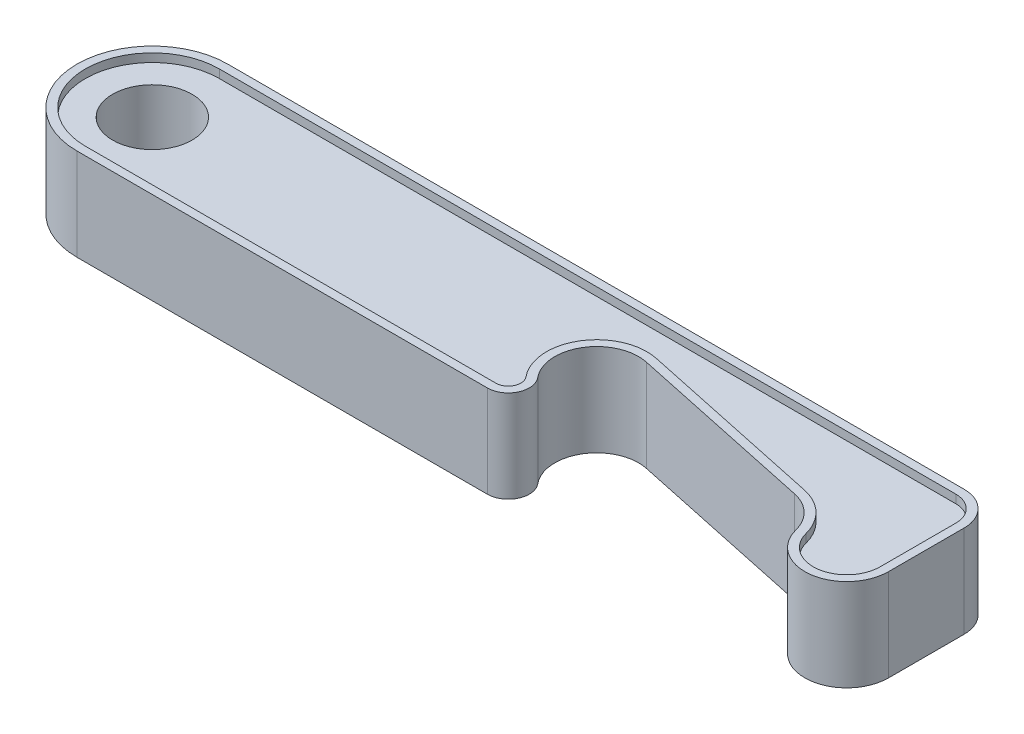
ISO-10303-21;
HEADER;
FILE_DESCRIPTION(('STEP AP214'),'2;1');
FILE_NAME('part.step','',(''),(''),'','','');
FILE_SCHEMA(('AUTOMOTIVE_DESIGN { 1 0 10303 214 1 1 1 1 }'));
ENDSEC;
DATA;
#1=APPLICATION_CONTEXT('core data for automotive mechanical design processes');
#2=APPLICATION_PROTOCOL_DEFINITION('international standard','automotive_design',2000,#1);
#3=PRODUCT_CONTEXT('',#1,'mechanical');
#4=PRODUCT('Part','Part','',(#3));
#5=PRODUCT_RELATED_PRODUCT_CATEGORY('part','',(#4));
#6=PRODUCT_DEFINITION_FORMATION('','',#4);
#7=PRODUCT_DEFINITION_CONTEXT('part definition',#1,'design');
#8=PRODUCT_DEFINITION('design','',#6,#7);
#9=PRODUCT_DEFINITION_SHAPE('','',#8);
#10=(LENGTH_UNIT() NAMED_UNIT(*) SI_UNIT(.MILLI.,.METRE.));
#11=(NAMED_UNIT(*) PLANE_ANGLE_UNIT() SI_UNIT($,.RADIAN.));
#12=(NAMED_UNIT(*) SI_UNIT($,.STERADIAN.) SOLID_ANGLE_UNIT());
#13=UNCERTAINTY_MEASURE_WITH_UNIT(LENGTH_MEASURE(1.E-05),#10,'distance_accuracy_value','');
#14=(GEOMETRIC_REPRESENTATION_CONTEXT(3) GLOBAL_UNCERTAINTY_ASSIGNED_CONTEXT((#13)) GLOBAL_UNIT_ASSIGNED_CONTEXT((#10,
#11,#12)) REPRESENTATION_CONTEXT('',''));
#15=CARTESIAN_POINT('',(0.,0.,0.));
#16=DIRECTION('',(0.,0.,1.));
#17=DIRECTION('',(1.,0.,0.));
#18=AXIS2_PLACEMENT_3D('',#15,#16,#17);
#19=CARTESIAN_POINT('',(0.,5.5,-8.));
#20=DIRECTION('',(0.,0.,-1.));
#21=DIRECTION('',(-1.,0.,0.));
#22=AXIS2_PLACEMENT_3D('',#19,#20,#21);
#23=PLANE('',#22);
#24=DIRECTION('',(1.,0.,0.));
#25=VECTOR('',#24,1.);
#26=CARTESIAN_POINT('',(0.,-4.5,-8.));
#27=LINE('',#26,#25);
#28=CARTESIAN_POINT('',(0.,-4.5,-8.));
#29=VERTEX_POINT('',#28);
#30=CARTESIAN_POINT('',(88.,-4.5,-8.));
#31=VERTEX_POINT('',#30);
#32=EDGE_CURVE('E120',#29,#31,#27,.T.);
#33=ORIENTED_EDGE('',*,*,#32,.F.);
#34=DIRECTION('',(0.,-1.,0.));
#35=VECTOR('',#34,1.);
#36=CARTESIAN_POINT('',(0.,5.5,-8.));
#37=LINE('',#36,#35);
#38=CARTESIAN_POINT('',(0.,-5.5,-8.));
#39=VERTEX_POINT('',#38);
#40=EDGE_CURVE('E327',#29,#39,#37,.T.);
#41=ORIENTED_EDGE('',*,*,#40,.T.);
#42=DIRECTION('',(1.,0.,0.));
#43=VECTOR('',#42,1.);
#44=CARTESIAN_POINT('',(0.,-5.5,-8.));
#45=LINE('',#44,#43);
#46=CARTESIAN_POINT('',(88.,-5.5,-8.));
#47=VERTEX_POINT('',#46);
#48=EDGE_CURVE('E575',#39,#47,#45,.T.);
#49=ORIENTED_EDGE('',*,*,#48,.T.);
#50=DIRECTION('',(0.,-1.,0.));
#51=VECTOR('',#50,1.);
#52=CARTESIAN_POINT('',(88.,5.5,-8.));
#53=LINE('',#52,#51);
#54=EDGE_CURVE('E368',#31,#47,#53,.T.);
#55=ORIENTED_EDGE('',*,*,#54,.F.);
#56=EDGE_LOOP('',(#33,#41,#49,#55));
#57=FACE_BOUND('',#56,.T.);
#58=ADVANCED_FACE('F103',(#57),#23,.F.);
#59=CARTESIAN_POINT('',(0.,5.5,0.));
#60=DIRECTION('',(0.,-1.,0.));
#61=DIRECTION('',(0.,0.,-1.));
#62=AXIS2_PLACEMENT_3D('',#59,#60,#61);
#63=CYLINDRICAL_SURFACE('',#62,8.);
#64=ORIENTED_EDGE('',*,*,#40,.F.);
#65=CARTESIAN_POINT('',(0.,-4.5,0.));
#66=DIRECTION('',(0.,1.,0.));
#67=DIRECTION('',(0.,0.,1.));
#68=AXIS2_PLACEMENT_3D('',#65,#66,#67);
#69=CIRCLE('',#68,8.);
#70=CARTESIAN_POINT('',(0.,-4.5,8.));
#71=VERTEX_POINT('',#70);
#72=EDGE_CURVE('E127',#29,#71,#69,.T.);
#73=ORIENTED_EDGE('',*,*,#72,.T.);
#74=DIRECTION('',(0.,-1.,0.));
#75=VECTOR('',#74,1.);
#76=CARTESIAN_POINT('',(0.,5.5,8.));
#77=LINE('',#76,#75);
#78=CARTESIAN_POINT('',(0.,-5.5,8.));
#79=VERTEX_POINT('',#78);
#80=EDGE_CURVE('E337',#71,#79,#77,.T.);
#81=ORIENTED_EDGE('',*,*,#80,.T.);
#82=CARTESIAN_POINT('',(0.,-5.5,0.));
#83=DIRECTION('',(0.,1.,0.));
#84=DIRECTION('',(0.,0.,1.));
#85=AXIS2_PLACEMENT_3D('',#82,#83,#84);
#86=CIRCLE('',#85,8.);
#87=EDGE_CURVE('E334',#39,#79,#86,.T.);
#88=ORIENTED_EDGE('',*,*,#87,.F.);
#89=EDGE_LOOP('',(#64,#73,#81,#88));
#90=FACE_BOUND('',#89,.T.);
#91=ADVANCED_FACE('F490',(#90),#63,.F.);
#92=CARTESIAN_POINT('',(0.,5.5,8.));
#93=DIRECTION('',(0.,0.,-1.));
#94=DIRECTION('',(-1.,0.,0.));
#95=AXIS2_PLACEMENT_3D('',#92,#93,#94);
#96=PLANE('',#95);
#97=ORIENTED_EDGE('',*,*,#80,.F.);
#98=DIRECTION('',(1.,0.,0.));
#99=VECTOR('',#98,1.);
#100=CARTESIAN_POINT('',(0.,-4.5,8.));
#101=LINE('',#100,#99);
#102=CARTESIAN_POINT('',(49.0303312216233,-4.5,8.));
#103=VERTEX_POINT('',#102);
#104=EDGE_CURVE('E606',#71,#103,#101,.T.);
#105=ORIENTED_EDGE('',*,*,#104,.T.);
#106=DIRECTION('',(0.,-1.,0.));
#107=VECTOR('',#106,1.);
#108=CARTESIAN_POINT('',(49.0303312216233,5.5,8.));
#109=LINE('',#108,#107);
#110=CARTESIAN_POINT('',(49.0303312216233,-5.5,8.));
#111=VERTEX_POINT('',#110);
#112=EDGE_CURVE('E341',#103,#111,#109,.T.);
#113=ORIENTED_EDGE('',*,*,#112,.T.);
#114=DIRECTION('',(1.,0.,0.));
#115=VECTOR('',#114,1.);
#116=CARTESIAN_POINT('',(0.,-5.5,8.));
#117=LINE('',#116,#115);
#118=EDGE_CURVE('E553',#79,#111,#117,.T.);
#119=ORIENTED_EDGE('',*,*,#118,.F.);
#120=EDGE_LOOP('',(#97,#105,#113,#119));
#121=FACE_BOUND('',#120,.T.);
#122=ADVANCED_FACE('F496',(#121),#96,.T.);
#123=CARTESIAN_POINT('',(49.0303312216233,5.5,6.5));
#124=DIRECTION('',(0.,-1.,0.));
#125=DIRECTION('',(0.,0.,-1.));
#126=AXIS2_PLACEMENT_3D('',#123,#124,#125);
#127=CYLINDRICAL_SURFACE('',#126,1.5);
#128=ORIENTED_EDGE('',*,*,#112,.F.);
#129=CARTESIAN_POINT('',(49.0303312216233,-4.5,6.5));
#130=DIRECTION('',(0.,1.,0.));
#131=DIRECTION('',(0.,0.,1.));
#132=AXIS2_PLACEMENT_3D('',#129,#130,#131);
#133=CIRCLE('',#132,1.5);
#134=CARTESIAN_POINT('',(50.1857961015929,-4.5,5.54349547248493));
#135=VERTEX_POINT('',#134);
#136=EDGE_CURVE('E611',#103,#135,#133,.T.);
#137=ORIENTED_EDGE('',*,*,#136,.T.);
#138=DIRECTION('',(0.,-1.,0.));
#139=VECTOR('',#138,1.);
#140=CARTESIAN_POINT('',(50.1857961015929,5.5,5.54349547248493));
#141=LINE('',#140,#139);
#142=CARTESIAN_POINT('',(50.1857961015929,-5.5,5.54349547248493));
#143=VERTEX_POINT('',#142);
#144=EDGE_CURVE('E345',#135,#143,#141,.T.);
#145=ORIENTED_EDGE('',*,*,#144,.T.);
#146=CARTESIAN_POINT('',(49.0303312216233,-5.5,6.5));
#147=DIRECTION('',(0.,1.,0.));
#148=DIRECTION('',(0.,0.,1.));
#149=AXIS2_PLACEMENT_3D('',#146,#147,#148);
#150=CIRCLE('',#149,1.5);
#151=EDGE_CURVE('E596',#111,#143,#150,.T.);
#152=ORIENTED_EDGE('',*,*,#151,.F.);
#153=EDGE_LOOP('',(#128,#137,#145,#152));
#154=FACE_BOUND('',#153,.T.);
#155=ADVANCED_FACE('F609',(#154),#127,.F.);
#156=CARTESIAN_POINT('',(54.8076556214714,5.5,1.71747736242466));
#157=DIRECTION('',(0.,-1.,0.));
#158=DIRECTION('',(0.,0.,-1.));
#159=AXIS2_PLACEMENT_3D('',#156,#157,#158);
#160=CYLINDRICAL_SURFACE('',#159,6.);
#161=CARTESIAN_POINT('',(54.8076556214714,-4.5,1.71747736242466));
#162=DIRECTION('',(0.,1.,0.));
#163=DIRECTION('',(0.,0.,1.));
#164=AXIS2_PLACEMENT_3D('',#161,#162,#163);
#165=CIRCLE('',#164,6.);
#166=CARTESIAN_POINT('',(56.0551257663779,-4.5,-4.15140824197818));
#167=VERTEX_POINT('',#166);
#168=EDGE_CURVE('E647',#167,#135,#165,.T.);
#169=ORIENTED_EDGE('',*,*,#168,.F.);
#170=DIRECTION('',(0.,-1.,0.));
#171=VECTOR('',#170,1.);
#172=CARTESIAN_POINT('',(56.0551257663779,5.5,-4.15140824197818));
#173=LINE('',#172,#171);
#174=CARTESIAN_POINT('',(56.0551257663779,-5.5,-4.15140824197818));
#175=VERTEX_POINT('',#174);
#176=EDGE_CURVE('E349',#167,#175,#173,.T.);
#177=ORIENTED_EDGE('',*,*,#176,.T.);
#178=CARTESIAN_POINT('',(54.8076556214714,-5.5,1.71747736242466));
#179=DIRECTION('',(0.,1.,0.));
#180=DIRECTION('',(0.,0.,1.));
#181=AXIS2_PLACEMENT_3D('',#178,#179,#180);
#182=CIRCLE('',#181,6.);
#183=EDGE_CURVE('E593',#175,#143,#182,.T.);
#184=ORIENTED_EDGE('',*,*,#183,.T.);
#185=ORIENTED_EDGE('',*,*,#144,.F.);
#186=EDGE_LOOP('',(#169,#177,#184,#185));
#187=FACE_BOUND('',#186,.T.);
#188=ADVANCED_FACE('F614',(#187),#160,.T.);
#189=CARTESIAN_POINT('',(78.5551257663779,5.5,0.631114395597155));
#190=DIRECTION('',(-0.207911690817753,0.,0.978147600733807));
#191=DIRECTION('',(0.978147600733807,0.,0.207911690817753));
#192=AXIS2_PLACEMENT_3D('',#189,#190,#191);
#193=PLANE('',#192);
#194=DIRECTION('',(-0.978147600733807,0.,-0.207911690817753));
#195=VECTOR('',#194,1.);
#196=CARTESIAN_POINT('',(3.26737504864885,-4.5,-15.3717910328325));
#197=LINE('',#196,#195);
#198=CARTESIAN_POINT('',(78.5551257663779,-4.5,0.631114395597155));
#199=VERTEX_POINT('',#198);
#200=EDGE_CURVE('E623',#199,#167,#197,.T.);
#201=ORIENTED_EDGE('',*,*,#200,.F.);
#202=DIRECTION('',(0.,-1.,0.));
#203=VECTOR('',#202,1.);
#204=CARTESIAN_POINT('',(78.5551257663779,5.5,0.631114395597155));
#205=LINE('',#204,#203);
#206=CARTESIAN_POINT('',(78.5551257663779,-5.5,0.631114395597155));
#207=VERTEX_POINT('',#206);
#208=EDGE_CURVE('E353',#199,#207,#205,.T.);
#209=ORIENTED_EDGE('',*,*,#208,.T.);
#210=DIRECTION('',(-0.978147600733807,0.,-0.207911690817753));
#211=VECTOR('',#210,1.);
#212=CARTESIAN_POINT('',(78.5551257663779,-5.5,0.631114395597155));
#213=LINE('',#212,#211);
#214=EDGE_CURVE('E590',#207,#175,#213,.T.);
#215=ORIENTED_EDGE('',*,*,#214,.T.);
#216=ORIENTED_EDGE('',*,*,#176,.F.);
#217=EDGE_LOOP('',(#201,#209,#215,#216));
#218=FACE_BOUND('',#217,.T.);
#219=ADVANCED_FACE('F620',(#218),#193,.F.);
#220=CARTESIAN_POINT('',(77.3076556214714,5.5,6.5));
#221=DIRECTION('',(0.,-1.,0.));
#222=DIRECTION('',(0.,0.,-1.));
#223=AXIS2_PLACEMENT_3D('',#220,#221,#222);
#224=CYLINDRICAL_SURFACE('',#223,5.99999999999999);
#225=ORIENTED_EDGE('',*,*,#208,.F.);
#226=CARTESIAN_POINT('',(77.3076556214714,-4.5,6.5));
#227=DIRECTION('',(0.,1.,0.));
#228=DIRECTION('',(0.,0.,1.));
#229=AXIS2_PLACEMENT_3D('',#226,#227,#228);
#230=CIRCLE('',#229,5.99999999999999);
#231=CARTESIAN_POINT('',(83.1230622485886,-4.5,5.0231635969812));
#232=VERTEX_POINT('',#231);
#233=EDGE_CURVE('E628',#199,#232,#230,.F.);
#234=ORIENTED_EDGE('',*,*,#233,.T.);
#235=DIRECTION('',(0.,-1.,0.));
#236=VECTOR('',#235,1.);
#237=CARTESIAN_POINT('',(83.1230622485886,5.5,5.0231635969812));
#238=LINE('',#237,#236);
#239=CARTESIAN_POINT('',(83.1230622485886,-5.5,5.0231635969812));
#240=VERTEX_POINT('',#239);
#241=EDGE_CURVE('E357',#232,#240,#238,.T.);
#242=ORIENTED_EDGE('',*,*,#241,.T.);
#243=CARTESIAN_POINT('',(77.3076556214714,-5.5,6.5));
#244=DIRECTION('',(0.,-1.,0.));
#245=DIRECTION('',(0.,0.,-1.));
#246=AXIS2_PLACEMENT_3D('',#243,#244,#245);
#247=CIRCLE('',#246,5.99999999999999);
#248=EDGE_CURVE('E587',#207,#240,#247,.T.);
#249=ORIENTED_EDGE('',*,*,#248,.F.);
#250=EDGE_LOOP('',(#225,#234,#242,#249));
#251=FACE_BOUND('',#250,.T.);
#252=ADVANCED_FACE('F626',(#251),#224,.T.);
#253=CARTESIAN_POINT('',(87.,5.5,4.03860599496867));
#254=DIRECTION('',(0.,-1.,0.));
#255=DIRECTION('',(0.,0.,-1.));
#256=AXIS2_PLACEMENT_3D('',#253,#254,#255);
#257=CYLINDRICAL_SURFACE('',#256,4.00000000000001);
#258=CARTESIAN_POINT('',(87.,-4.5,4.03860599496867));
#259=DIRECTION('',(0.,1.,0.));
#260=DIRECTION('',(0.,0.,1.));
#261=AXIS2_PLACEMENT_3D('',#258,#259,#260);
#262=CIRCLE('',#261,4.00000000000001);
#263=CARTESIAN_POINT('',(91.,-4.5,4.03860599496867));
#264=VERTEX_POINT('',#263);
#265=EDGE_CURVE('E651',#264,#232,#262,.F.);
#266=ORIENTED_EDGE('',*,*,#265,.F.);
#267=DIRECTION('',(0.,-1.,0.));
#268=VECTOR('',#267,1.);
#269=CARTESIAN_POINT('',(91.,5.5,4.03860599496867));
#270=LINE('',#269,#268);
#271=CARTESIAN_POINT('',(91.,-5.5,4.03860599496867));
#272=VERTEX_POINT('',#271);
#273=EDGE_CURVE('E361',#264,#272,#270,.T.);
#274=ORIENTED_EDGE('',*,*,#273,.T.);
#275=CARTESIAN_POINT('',(87.,-5.5,4.03860599496867));
#276=DIRECTION('',(0.,-1.,0.));
#277=DIRECTION('',(0.,0.,-1.));
#278=AXIS2_PLACEMENT_3D('',#275,#276,#277);
#279=CIRCLE('',#278,4.00000000000001);
#280=EDGE_CURVE('E584',#272,#240,#279,.T.);
#281=ORIENTED_EDGE('',*,*,#280,.T.);
#282=ORIENTED_EDGE('',*,*,#241,.F.);
#283=EDGE_LOOP('',(#266,#274,#281,#282));
#284=FACE_BOUND('',#283,.T.);
#285=ADVANCED_FACE('F527',(#284),#257,.F.);
#286=CARTESIAN_POINT('',(91.,5.5,-5.));
#287=DIRECTION('',(1.,0.,0.));
#288=DIRECTION('',(0.,0.,-1.));
#289=AXIS2_PLACEMENT_3D('',#286,#287,#288);
#290=PLANE('',#289);
#291=DIRECTION('',(0.,0.,1.));
#292=VECTOR('',#291,1.);
#293=CARTESIAN_POINT('',(91.,-4.5,0.));
#294=LINE('',#293,#292);
#295=CARTESIAN_POINT('',(91.,-4.5,-5.));
#296=VERTEX_POINT('',#295);
#297=EDGE_CURVE('E636',#296,#264,#294,.T.);
#298=ORIENTED_EDGE('',*,*,#297,.F.);
#299=DIRECTION('',(0.,-1.,0.));
#300=VECTOR('',#299,1.);
#301=CARTESIAN_POINT('',(91.,5.5,-5.));
#302=LINE('',#301,#300);
#303=CARTESIAN_POINT('',(91.,-5.5,-5.));
#304=VERTEX_POINT('',#303);
#305=EDGE_CURVE('E365',#296,#304,#302,.T.);
#306=ORIENTED_EDGE('',*,*,#305,.T.);
#307=DIRECTION('',(0.,0.,1.));
#308=VECTOR('',#307,1.);
#309=CARTESIAN_POINT('',(91.,-5.5,-5.));
#310=LINE('',#309,#308);
#311=EDGE_CURVE('E581',#304,#272,#310,.T.);
#312=ORIENTED_EDGE('',*,*,#311,.T.);
#313=ORIENTED_EDGE('',*,*,#273,.F.);
#314=EDGE_LOOP('',(#298,#306,#312,#313));
#315=FACE_BOUND('',#314,.T.);
#316=ADVANCED_FACE('F521',(#315),#290,.F.);
#317=CARTESIAN_POINT('',(88.,5.5,-5.));
#318=DIRECTION('',(0.,-1.,0.));
#319=DIRECTION('',(0.,0.,-1.));
#320=AXIS2_PLACEMENT_3D('',#317,#318,#319);
#321=CYLINDRICAL_SURFACE('',#320,3.);
#322=CARTESIAN_POINT('',(88.,-4.5,-5.));
#323=DIRECTION('',(0.,1.,0.));
#324=DIRECTION('',(0.,0.,1.));
#325=AXIS2_PLACEMENT_3D('',#322,#323,#324);
#326=CIRCLE('',#325,3.);
#327=EDGE_CURVE('E555',#31,#296,#326,.F.);
#328=ORIENTED_EDGE('',*,*,#327,.F.);
#329=ORIENTED_EDGE('',*,*,#54,.T.);
#330=CARTESIAN_POINT('',(88.,-5.5,-5.));
#331=DIRECTION('',(0.,-1.,0.));
#332=DIRECTION('',(0.,0.,-1.));
#333=AXIS2_PLACEMENT_3D('',#330,#331,#332);
#334=CIRCLE('',#333,3.);
#335=EDGE_CURVE('E578',#47,#304,#334,.T.);
#336=ORIENTED_EDGE('',*,*,#335,.T.);
#337=ORIENTED_EDGE('',*,*,#305,.F.);
#338=EDGE_LOOP('',(#328,#329,#336,#337));
#339=FACE_BOUND('',#338,.T.);
#340=ADVANCED_FACE('F518',(#339),#321,.F.);
#341=CARTESIAN_POINT('',(0.,5.5,-9.));
#342=DIRECTION('',(0.,0.,-1.));
#343=DIRECTION('',(-1.,0.,0.));
#344=AXIS2_PLACEMENT_3D('',#341,#342,#343);
#345=PLANE('',#344);
#346=DIRECTION('',(1.,0.,0.));
#347=VECTOR('',#346,1.);
#348=CARTESIAN_POINT('',(0.,-5.5,-9.));
#349=LINE('',#348,#347);
#350=CARTESIAN_POINT('',(0.,-5.5,-9.));
#351=VERTEX_POINT('',#350);
#352=CARTESIAN_POINT('',(88.,-5.5,-9.));
#353=VERTEX_POINT('',#352);
#354=EDGE_CURVE('E326',#351,#353,#349,.T.);
#355=ORIENTED_EDGE('',*,*,#354,.F.);
#356=DIRECTION('',(0.,-1.,0.));
#357=VECTOR('',#356,1.);
#358=CARTESIAN_POINT('',(0.,5.5,-9.));
#359=LINE('',#358,#357);
#360=CARTESIAN_POINT('',(0.,5.5,-9.));
#361=VERTEX_POINT('',#360);
#362=EDGE_CURVE('E12',#361,#351,#359,.T.);
#363=ORIENTED_EDGE('',*,*,#362,.F.);
#364=DIRECTION('',(1.,0.,0.));
#365=VECTOR('',#364,1.);
#366=CARTESIAN_POINT('',(0.,5.5,-9.));
#367=LINE('',#366,#365);
#368=CARTESIAN_POINT('',(88.,5.5,-9.));
#369=VERTEX_POINT('',#368);
#370=EDGE_CURVE('E369',#361,#369,#367,.T.);
#371=ORIENTED_EDGE('',*,*,#370,.T.);
#372=DIRECTION('',(0.,-1.,0.));
#373=VECTOR('',#372,1.);
#374=CARTESIAN_POINT('',(88.,5.5,-9.));
#375=LINE('',#374,#373);
#376=EDGE_CURVE('E107',#369,#353,#375,.T.);
#377=ORIENTED_EDGE('',*,*,#376,.T.);
#378=EDGE_LOOP('',(#355,#363,#371,#377));
#379=FACE_BOUND('',#378,.T.);
#380=ADVANCED_FACE('F105',(#379),#345,.T.);
#381=CARTESIAN_POINT('',(0.,5.5,0.));
#382=DIRECTION('',(0.,-1.,0.));
#383=DIRECTION('',(0.,0.,-1.));
#384=AXIS2_PLACEMENT_3D('',#381,#382,#383);
#385=CYLINDRICAL_SURFACE('',#384,9.);
#386=CARTESIAN_POINT('',(0.,-5.5,0.));
#387=DIRECTION('',(0.,1.,0.));
#388=DIRECTION('',(0.,0.,1.));
#389=AXIS2_PLACEMENT_3D('',#386,#387,#388);
#390=CIRCLE('',#389,9.);
#391=CARTESIAN_POINT('',(0.,-5.5,9.));
#392=VERTEX_POINT('',#391);
#393=EDGE_CURVE('E373',#351,#392,#390,.T.);
#394=ORIENTED_EDGE('',*,*,#393,.T.);
#395=DIRECTION('',(0.,-1.,0.));
#396=VECTOR('',#395,1.);
#397=CARTESIAN_POINT('',(0.,5.5,9.));
#398=LINE('',#397,#396);
#399=CARTESIAN_POINT('',(0.,5.5,9.));
#400=VERTEX_POINT('',#399);
#401=EDGE_CURVE('E112',#400,#392,#398,.T.);
#402=ORIENTED_EDGE('',*,*,#401,.F.);
#403=CARTESIAN_POINT('',(0.,5.5,0.));
#404=DIRECTION('',(0.,1.,0.));
#405=DIRECTION('',(0.,0.,1.));
#406=AXIS2_PLACEMENT_3D('',#403,#404,#405);
#407=CIRCLE('',#406,9.);
#408=EDGE_CURVE('E394',#361,#400,#407,.T.);
#409=ORIENTED_EDGE('',*,*,#408,.F.);
#410=ORIENTED_EDGE('',*,*,#362,.T.);
#411=EDGE_LOOP('',(#394,#402,#409,#410));
#412=FACE_BOUND('',#411,.T.);
#413=ADVANCED_FACE('F449',(#412),#385,.T.);
#414=CARTESIAN_POINT('',(0.,5.5,9.));
#415=DIRECTION('',(0.,0.,-1.));
#416=DIRECTION('',(-1.,0.,0.));
#417=AXIS2_PLACEMENT_3D('',#414,#415,#416);
#418=PLANE('',#417);
#419=DIRECTION('',(1.,0.,0.));
#420=VECTOR('',#419,1.);
#421=CARTESIAN_POINT('',(0.,-5.5,9.));
#422=LINE('',#421,#420);
#423=CARTESIAN_POINT('',(49.0303312216233,-5.5,9.));
#424=VERTEX_POINT('',#423);
#425=EDGE_CURVE('E416',#392,#424,#422,.T.);
#426=ORIENTED_EDGE('',*,*,#425,.T.);
#427=DIRECTION('',(0.,-1.,0.));
#428=VECTOR('',#427,1.);
#429=CARTESIAN_POINT('',(49.0303312216233,5.5,9.));
#430=LINE('',#429,#428);
#431=CARTESIAN_POINT('',(49.0303312216233,5.5,9.));
#432=VERTEX_POINT('',#431);
#433=EDGE_CURVE('E421',#432,#424,#430,.T.);
#434=ORIENTED_EDGE('',*,*,#433,.F.);
#435=DIRECTION('',(1.,0.,0.));
#436=VECTOR('',#435,1.);
#437=CARTESIAN_POINT('',(0.,5.5,9.));
#438=LINE('',#437,#436);
#439=EDGE_CURVE('E392',#400,#432,#438,.T.);
#440=ORIENTED_EDGE('',*,*,#439,.F.);
#441=ORIENTED_EDGE('',*,*,#401,.T.);
#442=EDGE_LOOP('',(#426,#434,#440,#441));
#443=FACE_BOUND('',#442,.T.);
#444=ADVANCED_FACE('F453',(#443),#418,.F.);
#445=CARTESIAN_POINT('',(49.0303312216233,5.5,6.5));
#446=DIRECTION('',(0.,-1.,0.));
#447=DIRECTION('',(0.,0.,-1.));
#448=AXIS2_PLACEMENT_3D('',#445,#446,#447);
#449=CYLINDRICAL_SURFACE('',#448,2.5);
#450=CARTESIAN_POINT('',(49.0303312216233,-5.5,6.5));
#451=DIRECTION('',(0.,1.,0.));
#452=DIRECTION('',(0.,0.,1.));
#453=AXIS2_PLACEMENT_3D('',#450,#451,#452);
#454=CIRCLE('',#453,2.5);
#455=CARTESIAN_POINT('',(50.9561060215727,-5.5,4.90582578747489));
#456=VERTEX_POINT('',#455);
#457=EDGE_CURVE('E413',#424,#456,#454,.T.);
#458=ORIENTED_EDGE('',*,*,#457,.T.);
#459=DIRECTION('',(0.,-1.,0.));
#460=VECTOR('',#459,1.);
#461=CARTESIAN_POINT('',(50.9561060215727,5.5,4.90582578747489));
#462=LINE('',#461,#460);
#463=CARTESIAN_POINT('',(50.9561060215727,5.5,4.90582578747489));
#464=VERTEX_POINT('',#463);
#465=EDGE_CURVE('E424',#464,#456,#462,.T.);
#466=ORIENTED_EDGE('',*,*,#465,.F.);
#467=CARTESIAN_POINT('',(49.0303312216233,5.5,6.5));
#468=DIRECTION('',(0.,1.,0.));
#469=DIRECTION('',(0.,0.,1.));
#470=AXIS2_PLACEMENT_3D('',#467,#468,#469);
#471=CIRCLE('',#470,2.5);
#472=EDGE_CURVE('E390',#432,#464,#471,.T.);
#473=ORIENTED_EDGE('',*,*,#472,.F.);
#474=ORIENTED_EDGE('',*,*,#433,.T.);
#475=EDGE_LOOP('',(#458,#466,#473,#474));
#476=FACE_BOUND('',#475,.T.);
#477=ADVANCED_FACE('F480',(#476),#449,.T.);
#478=CARTESIAN_POINT('',(54.8076556214714,5.5,1.71747736242466));
#479=DIRECTION('',(0.,-1.,0.));
#480=DIRECTION('',(0.,0.,-1.));
#481=AXIS2_PLACEMENT_3D('',#478,#479,#480);
#482=CYLINDRICAL_SURFACE('',#481,5.);
#483=CARTESIAN_POINT('',(54.8076556214714,-5.5,1.71747736242466));
#484=DIRECTION('',(0.,1.,0.));
#485=DIRECTION('',(0.,0.,1.));
#486=AXIS2_PLACEMENT_3D('',#483,#484,#485);
#487=CIRCLE('',#486,5.);
#488=CARTESIAN_POINT('',(55.8472140755601,-5.5,-3.17326064124437));
#489=VERTEX_POINT('',#488);
#490=EDGE_CURVE('E410',#489,#456,#487,.T.);
#491=ORIENTED_EDGE('',*,*,#490,.F.);
#492=DIRECTION('',(0.,-1.,0.));
#493=VECTOR('',#492,1.);
#494=CARTESIAN_POINT('',(55.8472140755601,5.5,-3.17326064124437));
#495=LINE('',#494,#493);
#496=CARTESIAN_POINT('',(55.8472140755601,5.5,-3.17326064124437));
#497=VERTEX_POINT('',#496);
#498=EDGE_CURVE('E426',#497,#489,#495,.T.);
#499=ORIENTED_EDGE('',*,*,#498,.F.);
#500=CARTESIAN_POINT('',(54.8076556214714,5.5,1.71747736242466));
#501=DIRECTION('',(0.,1.,0.));
#502=DIRECTION('',(0.,0.,1.));
#503=AXIS2_PLACEMENT_3D('',#500,#501,#502);
#504=CIRCLE('',#503,5.);
#505=EDGE_CURVE('E387',#497,#464,#504,.T.);
#506=ORIENTED_EDGE('',*,*,#505,.T.);
#507=ORIENTED_EDGE('',*,*,#465,.T.);
#508=EDGE_LOOP('',(#491,#499,#506,#507));
#509=FACE_BOUND('',#508,.T.);
#510=ADVANCED_FACE('F478',(#509),#482,.F.);
#511=CARTESIAN_POINT('',(78.3472140755601,5.5,1.60926199633096));
#512=DIRECTION('',(-0.207911690817753,0.,0.978147600733807));
#513=DIRECTION('',(0.978147600733807,0.,0.207911690817753));
#514=AXIS2_PLACEMENT_3D('',#511,#512,#513);
#515=PLANE('',#514);
#516=DIRECTION('',(-0.978147600733807,0.,-0.207911690817753));
#517=VECTOR('',#516,1.);
#518=CARTESIAN_POINT('',(78.3472140755601,-5.5,1.60926199633096));
#519=LINE('',#518,#517);
#520=CARTESIAN_POINT('',(78.3472140755601,-5.5,1.60926199633096));
#521=VERTEX_POINT('',#520);
#522=EDGE_CURVE('E407',#521,#489,#519,.T.);
#523=ORIENTED_EDGE('',*,*,#522,.F.);
#524=DIRECTION('',(0.,-1.,0.));
#525=VECTOR('',#524,1.);
#526=CARTESIAN_POINT('',(78.3472140755601,5.5,1.60926199633096));
#527=LINE('',#526,#525);
#528=CARTESIAN_POINT('',(78.3472140755601,5.5,1.60926199633096));
#529=VERTEX_POINT('',#528);
#530=EDGE_CURVE('E428',#529,#521,#527,.T.);
#531=ORIENTED_EDGE('',*,*,#530,.F.);
#532=DIRECTION('',(-0.978147600733807,0.,-0.207911690817753));
#533=VECTOR('',#532,1.);
#534=CARTESIAN_POINT('',(78.3472140755601,5.5,1.60926199633096));
#535=LINE('',#534,#533);
#536=EDGE_CURVE('E384',#529,#497,#535,.T.);
#537=ORIENTED_EDGE('',*,*,#536,.T.);
#538=ORIENTED_EDGE('',*,*,#498,.T.);
#539=EDGE_LOOP('',(#523,#531,#537,#538));
#540=FACE_BOUND('',#539,.T.);
#541=ADVANCED_FACE('F475',(#540),#515,.T.);
#542=CARTESIAN_POINT('',(77.3076556214714,5.5,6.5));
#543=DIRECTION('',(0.,-1.,0.));
#544=DIRECTION('',(0.,0.,-1.));
#545=AXIS2_PLACEMENT_3D('',#542,#543,#544);
#546=CYLINDRICAL_SURFACE('',#545,5.);
#547=CARTESIAN_POINT('',(77.3076556214714,-5.5,6.5));
#548=DIRECTION('',(0.,-1.,0.));
#549=DIRECTION('',(0.,0.,-1.));
#550=AXIS2_PLACEMENT_3D('',#547,#548,#549);
#551=CIRCLE('',#550,5.);
#552=CARTESIAN_POINT('',(82.1538278107357,-5.5,5.26930299748433));
#553=VERTEX_POINT('',#552);
#554=EDGE_CURVE('E404',#521,#553,#551,.T.);
#555=ORIENTED_EDGE('',*,*,#554,.T.);
#556=DIRECTION('',(0.,-1.,0.));
#557=VECTOR('',#556,1.);
#558=CARTESIAN_POINT('',(82.1538278107357,5.5,5.26930299748433));
#559=LINE('',#558,#557);
#560=CARTESIAN_POINT('',(82.1538278107357,5.5,5.26930299748433));
#561=VERTEX_POINT('',#560);
#562=EDGE_CURVE('E430',#561,#553,#559,.T.);
#563=ORIENTED_EDGE('',*,*,#562,.F.);
#564=CARTESIAN_POINT('',(77.3076556214714,5.5,6.5));
#565=DIRECTION('',(0.,-1.,0.));
#566=DIRECTION('',(0.,0.,-1.));
#567=AXIS2_PLACEMENT_3D('',#564,#565,#566);
#568=CIRCLE('',#567,5.);
#569=EDGE_CURVE('E382',#529,#561,#568,.T.);
#570=ORIENTED_EDGE('',*,*,#569,.F.);
#571=ORIENTED_EDGE('',*,*,#530,.T.);
#572=EDGE_LOOP('',(#555,#563,#570,#571));
#573=FACE_BOUND('',#572,.T.);
#574=ADVANCED_FACE('F472',(#573),#546,.F.);
#575=CARTESIAN_POINT('',(87.,5.5,4.03860599496867));
#576=DIRECTION('',(0.,-1.,0.));
#577=DIRECTION('',(0.,0.,-1.));
#578=AXIS2_PLACEMENT_3D('',#575,#576,#577);
#579=CYLINDRICAL_SURFACE('',#578,5.00000000000002);
#580=CARTESIAN_POINT('',(87.,-5.5,4.03860599496867));
#581=DIRECTION('',(0.,-1.,0.));
#582=DIRECTION('',(0.,0.,-1.));
#583=AXIS2_PLACEMENT_3D('',#580,#581,#582);
#584=CIRCLE('',#583,5.00000000000002);
#585=CARTESIAN_POINT('',(92.,-5.5,4.03860599496867));
#586=VERTEX_POINT('',#585);
#587=EDGE_CURVE('E401',#586,#553,#584,.T.);
#588=ORIENTED_EDGE('',*,*,#587,.F.);
#589=DIRECTION('',(0.,-1.,0.));
#590=VECTOR('',#589,1.);
#591=CARTESIAN_POINT('',(92.,5.5,4.03860599496867));
#592=LINE('',#591,#590);
#593=CARTESIAN_POINT('',(92.,5.5,4.03860599496867));
#594=VERTEX_POINT('',#593);
#595=EDGE_CURVE('E432',#594,#586,#592,.T.);
#596=ORIENTED_EDGE('',*,*,#595,.F.);
#597=CARTESIAN_POINT('',(87.,5.5,4.03860599496867));
#598=DIRECTION('',(0.,-1.,0.));
#599=DIRECTION('',(0.,0.,-1.));
#600=AXIS2_PLACEMENT_3D('',#597,#598,#599);
#601=CIRCLE('',#600,5.00000000000002);
#602=EDGE_CURVE('E379',#594,#561,#601,.T.);
#603=ORIENTED_EDGE('',*,*,#602,.T.);
#604=ORIENTED_EDGE('',*,*,#562,.T.);
#605=EDGE_LOOP('',(#588,#596,#603,#604));
#606=FACE_BOUND('',#605,.T.);
#607=ADVANCED_FACE('F468',(#606),#579,.T.);
#608=CARTESIAN_POINT('',(92.,5.5,-5.));
#609=DIRECTION('',(1.,0.,0.));
#610=DIRECTION('',(0.,0.,-1.));
#611=AXIS2_PLACEMENT_3D('',#608,#609,#610);
#612=PLANE('',#611);
#613=DIRECTION('',(0.,0.,1.));
#614=VECTOR('',#613,1.);
#615=CARTESIAN_POINT('',(92.,-5.5,-5.));
#616=LINE('',#615,#614);
#617=CARTESIAN_POINT('',(92.,-5.5,-5.));
#618=VERTEX_POINT('',#617);
#619=EDGE_CURVE('E398',#618,#586,#616,.T.);
#620=ORIENTED_EDGE('',*,*,#619,.F.);
#621=DIRECTION('',(0.,-1.,0.));
#622=VECTOR('',#621,1.);
#623=CARTESIAN_POINT('',(92.,5.5,-5.));
#624=LINE('',#623,#622);
#625=CARTESIAN_POINT('',(92.,5.5,-5.));
#626=VERTEX_POINT('',#625);
#627=EDGE_CURVE('E433',#626,#618,#624,.T.);
#628=ORIENTED_EDGE('',*,*,#627,.F.);
#629=DIRECTION('',(0.,0.,1.));
#630=VECTOR('',#629,1.);
#631=CARTESIAN_POINT('',(92.,5.5,-5.));
#632=LINE('',#631,#630);
#633=EDGE_CURVE('E376',#626,#594,#632,.T.);
#634=ORIENTED_EDGE('',*,*,#633,.T.);
#635=ORIENTED_EDGE('',*,*,#595,.T.);
#636=EDGE_LOOP('',(#620,#628,#634,#635));
#637=FACE_BOUND('',#636,.T.);
#638=ADVANCED_FACE('F463',(#637),#612,.T.);
#639=CARTESIAN_POINT('',(88.,5.5,-5.));
#640=DIRECTION('',(0.,-1.,0.));
#641=DIRECTION('',(0.,0.,-1.));
#642=AXIS2_PLACEMENT_3D('',#639,#640,#641);
#643=CYLINDRICAL_SURFACE('',#642,4.);
#644=CARTESIAN_POINT('',(88.,-5.5,-5.));
#645=DIRECTION('',(0.,-1.,0.));
#646=DIRECTION('',(0.,0.,-1.));
#647=AXIS2_PLACEMENT_3D('',#644,#645,#646);
#648=CIRCLE('',#647,4.);
#649=EDGE_CURVE('E330',#353,#618,#648,.T.);
#650=ORIENTED_EDGE('',*,*,#649,.F.);
#651=ORIENTED_EDGE('',*,*,#376,.F.);
#652=CARTESIAN_POINT('',(88.,5.5,-5.));
#653=DIRECTION('',(0.,-1.,0.));
#654=DIRECTION('',(0.,0.,-1.));
#655=AXIS2_PLACEMENT_3D('',#652,#653,#654);
#656=CIRCLE('',#655,4.);
#657=EDGE_CURVE('E372',#369,#626,#656,.T.);
#658=ORIENTED_EDGE('',*,*,#657,.T.);
#659=ORIENTED_EDGE('',*,*,#627,.T.);
#660=EDGE_LOOP('',(#650,#651,#658,#659));
#661=FACE_BOUND('',#660,.T.);
#662=ADVANCED_FACE('F441',(#661),#643,.T.);
#663=CARTESIAN_POINT('',(88.,5.5,-5.));
#664=DIRECTION('',(0.,-1.,0.));
#665=DIRECTION('',(0.,0.,-1.));
#666=AXIS2_PLACEMENT_3D('',#663,#664,#665);
#667=PLANE('',#666);
#668=CARTESIAN_POINT('',(0.,5.5,0.));
#669=DIRECTION('',(0.,1.,0.));
#670=DIRECTION('',(0.,0.,1.));
#671=AXIS2_PLACEMENT_3D('',#668,#669,#670);
#672=CIRCLE('',#671,8.);
#673=CARTESIAN_POINT('',(0.,5.5,-8.));
#674=VERTEX_POINT('',#673);
#675=CARTESIAN_POINT('',(0.,5.5,8.));
#676=VERTEX_POINT('',#675);
#677=EDGE_CURVE('E550',#674,#676,#672,.T.);
#678=ORIENTED_EDGE('',*,*,#677,.F.);
#679=DIRECTION('',(1.,0.,0.));
#680=VECTOR('',#679,1.);
#681=CARTESIAN_POINT('',(0.,5.5,-8.));
#682=LINE('',#681,#680);
#683=CARTESIAN_POINT('',(88.,5.5,-8.));
#684=VERTEX_POINT('',#683);
#685=EDGE_CURVE('E324',#674,#684,#682,.T.);
#686=ORIENTED_EDGE('',*,*,#685,.T.);
#687=CARTESIAN_POINT('',(88.,5.5,-5.));
#688=DIRECTION('',(0.,-1.,0.));
#689=DIRECTION('',(0.,0.,-1.));
#690=AXIS2_PLACEMENT_3D('',#687,#688,#689);
#691=CIRCLE('',#690,3.);
#692=CARTESIAN_POINT('',(91.,5.5,-5.));
#693=VERTEX_POINT('',#692);
#694=EDGE_CURVE('E545',#684,#693,#691,.T.);
#695=ORIENTED_EDGE('',*,*,#694,.T.);
#696=DIRECTION('',(0.,0.,1.));
#697=VECTOR('',#696,1.);
#698=CARTESIAN_POINT('',(91.,5.5,-5.));
#699=LINE('',#698,#697);
#700=CARTESIAN_POINT('',(91.,5.5,4.03860599496867));
#701=VERTEX_POINT('',#700);
#702=EDGE_CURVE('E547',#693,#701,#699,.T.);
#703=ORIENTED_EDGE('',*,*,#702,.T.);
#704=CARTESIAN_POINT('',(87.,5.5,4.03860599496867));
#705=DIRECTION('',(0.,-1.,0.));
#706=DIRECTION('',(0.,0.,-1.));
#707=AXIS2_PLACEMENT_3D('',#704,#705,#706);
#708=CIRCLE('',#707,4.00000000000001);
#709=CARTESIAN_POINT('',(83.1230622485886,5.5,5.0231635969812));
#710=VERTEX_POINT('',#709);
#711=EDGE_CURVE('E559',#701,#710,#708,.T.);
#712=ORIENTED_EDGE('',*,*,#711,.T.);
#713=CARTESIAN_POINT('',(77.3076556214714,5.5,6.5));
#714=DIRECTION('',(0.,-1.,0.));
#715=DIRECTION('',(0.,0.,-1.));
#716=AXIS2_PLACEMENT_3D('',#713,#714,#715);
#717=CIRCLE('',#716,5.99999999999999);
#718=CARTESIAN_POINT('',(78.5551257663779,5.5,0.631114395597155));
#719=VERTEX_POINT('',#718);
#720=EDGE_CURVE('E562',#719,#710,#717,.T.);
#721=ORIENTED_EDGE('',*,*,#720,.F.);
#722=DIRECTION('',(-0.978147600733807,0.,-0.207911690817753));
#723=VECTOR('',#722,1.);
#724=CARTESIAN_POINT('',(78.5551257663779,5.5,0.631114395597155));
#725=LINE('',#724,#723);
#726=CARTESIAN_POINT('',(56.0551257663779,5.5,-4.15140824197818));
#727=VERTEX_POINT('',#726);
#728=EDGE_CURVE('E564',#719,#727,#725,.T.);
#729=ORIENTED_EDGE('',*,*,#728,.T.);
#730=CARTESIAN_POINT('',(54.8076556214714,5.5,1.71747736242466));
#731=DIRECTION('',(0.,1.,0.));
#732=DIRECTION('',(0.,0.,1.));
#733=AXIS2_PLACEMENT_3D('',#730,#731,#732);
#734=CIRCLE('',#733,6.);
#735=CARTESIAN_POINT('',(50.1857961015929,5.5,5.54349547248493));
#736=VERTEX_POINT('',#735);
#737=EDGE_CURVE('E567',#727,#736,#734,.T.);
#738=ORIENTED_EDGE('',*,*,#737,.T.);
#739=CARTESIAN_POINT('',(49.0303312216233,5.5,6.5));
#740=DIRECTION('',(0.,1.,0.));
#741=DIRECTION('',(0.,0.,1.));
#742=AXIS2_PLACEMENT_3D('',#739,#740,#741);
#743=CIRCLE('',#742,1.5);
#744=CARTESIAN_POINT('',(49.0303312216233,5.5,8.));
#745=VERTEX_POINT('',#744);
#746=EDGE_CURVE('E570',#745,#736,#743,.T.);
#747=ORIENTED_EDGE('',*,*,#746,.F.);
#748=DIRECTION('',(1.,0.,0.));
#749=VECTOR('',#748,1.);
#750=CARTESIAN_POINT('',(0.,5.5,8.));
#751=LINE('',#750,#749);
#752=EDGE_CURVE('E572',#676,#745,#751,.T.);
#753=ORIENTED_EDGE('',*,*,#752,.F.);
#754=EDGE_LOOP('',(#678,#686,#695,#703,#712,#721,#729,#738,#747,#753));
#755=FACE_BOUND('',#754,.T.);
#756=ORIENTED_EDGE('',*,*,#370,.F.);
#757=ORIENTED_EDGE('',*,*,#408,.T.);
#758=ORIENTED_EDGE('',*,*,#439,.T.);
#759=ORIENTED_EDGE('',*,*,#472,.T.);
#760=ORIENTED_EDGE('',*,*,#505,.F.);
#761=ORIENTED_EDGE('',*,*,#536,.F.);
#762=ORIENTED_EDGE('',*,*,#569,.T.);
#763=ORIENTED_EDGE('',*,*,#602,.F.);
#764=ORIENTED_EDGE('',*,*,#633,.F.);
#765=ORIENTED_EDGE('',*,*,#657,.F.);
#766=EDGE_LOOP('',(#756,#757,#758,#759,#760,#761,#762,#763,#764,#765));
#767=FACE_BOUND('',#766,.T.);
#768=ADVANCED_FACE('F457',(#755,#767),#667,.F.);
#769=CARTESIAN_POINT('',(88.,-5.5,-5.));
#770=DIRECTION('',(0.,-1.,0.));
#771=DIRECTION('',(0.,0.,-1.));
#772=AXIS2_PLACEMENT_3D('',#769,#770,#771);
#773=PLANE('',#772);
#774=ORIENTED_EDGE('',*,*,#48,.F.);
#775=ORIENTED_EDGE('',*,*,#87,.T.);
#776=ORIENTED_EDGE('',*,*,#118,.T.);
#777=ORIENTED_EDGE('',*,*,#151,.T.);
#778=ORIENTED_EDGE('',*,*,#183,.F.);
#779=ORIENTED_EDGE('',*,*,#214,.F.);
#780=ORIENTED_EDGE('',*,*,#248,.T.);
#781=ORIENTED_EDGE('',*,*,#280,.F.);
#782=ORIENTED_EDGE('',*,*,#311,.F.);
#783=ORIENTED_EDGE('',*,*,#335,.F.);
#784=EDGE_LOOP('',(#774,#775,#776,#777,#778,#779,#780,#781,#782,#783));
#785=FACE_BOUND('',#784,.T.);
#786=ORIENTED_EDGE('',*,*,#354,.T.);
#787=ORIENTED_EDGE('',*,*,#649,.T.);
#788=ORIENTED_EDGE('',*,*,#619,.T.);
#789=ORIENTED_EDGE('',*,*,#587,.T.);
#790=ORIENTED_EDGE('',*,*,#554,.F.);
#791=ORIENTED_EDGE('',*,*,#522,.T.);
#792=ORIENTED_EDGE('',*,*,#490,.T.);
#793=ORIENTED_EDGE('',*,*,#457,.F.);
#794=ORIENTED_EDGE('',*,*,#425,.F.);
#795=ORIENTED_EDGE('',*,*,#393,.F.);
#796=EDGE_LOOP('',(#786,#787,#788,#789,#790,#791,#792,#793,#794,#795));
#797=FACE_BOUND('',#796,.T.);
#798=ADVANCED_FACE('F444',(#785,#797),#773,.T.);
#799=CARTESIAN_POINT('',(0.,4.5,-8.));
#800=VERTEX_POINT('',#799);
#801=EDGE_CURVE('E316',#674,#800,#37,.T.);
#802=ORIENTED_EDGE('',*,*,#801,.T.);
#803=DIRECTION('',(1.,0.,0.));
#804=VECTOR('',#803,1.);
#805=CARTESIAN_POINT('',(0.,4.5,-8.));
#806=LINE('',#805,#804);
#807=CARTESIAN_POINT('',(88.,4.5,-8.));
#808=VERTEX_POINT('',#807);
#809=EDGE_CURVE('E301',#800,#808,#806,.T.);
#810=ORIENTED_EDGE('',*,*,#809,.T.);
#811=EDGE_CURVE('E366',#684,#808,#53,.T.);
#812=ORIENTED_EDGE('',*,*,#811,.F.);
#813=ORIENTED_EDGE('',*,*,#685,.F.);
#814=EDGE_LOOP('',(#802,#810,#812,#813));
#815=FACE_BOUND('',#814,.T.);
#816=ADVANCED_FACE('F322',(#815),#23,.F.);
#817=CARTESIAN_POINT('',(0.,4.5,0.));
#818=DIRECTION('',(0.,1.,0.));
#819=DIRECTION('',(0.,0.,1.));
#820=AXIS2_PLACEMENT_3D('',#817,#818,#819);
#821=CIRCLE('',#820,8.);
#822=CARTESIAN_POINT('',(0.,4.5,8.));
#823=VERTEX_POINT('',#822);
#824=EDGE_CURVE('E304',#800,#823,#821,.T.);
#825=ORIENTED_EDGE('',*,*,#824,.F.);
#826=ORIENTED_EDGE('',*,*,#801,.F.);
#827=ORIENTED_EDGE('',*,*,#677,.T.);
#828=EDGE_CURVE('E319',#676,#823,#77,.T.);
#829=ORIENTED_EDGE('',*,*,#828,.T.);
#830=EDGE_LOOP('',(#825,#826,#827,#829));
#831=FACE_BOUND('',#830,.T.);
#832=ADVANCED_FACE('F315',(#831),#63,.F.);
#833=DIRECTION('',(1.,0.,0.));
#834=VECTOR('',#833,1.);
#835=CARTESIAN_POINT('',(0.,4.5,8.));
#836=LINE('',#835,#834);
#837=CARTESIAN_POINT('',(49.0303312216233,4.5,8.));
#838=VERTEX_POINT('',#837);
#839=EDGE_CURVE('E320',#823,#838,#836,.T.);
#840=ORIENTED_EDGE('',*,*,#839,.F.);
#841=ORIENTED_EDGE('',*,*,#828,.F.);
#842=ORIENTED_EDGE('',*,*,#752,.T.);
#843=EDGE_CURVE('E338',#745,#838,#109,.T.);
#844=ORIENTED_EDGE('',*,*,#843,.T.);
#845=EDGE_LOOP('',(#840,#841,#842,#844));
#846=FACE_BOUND('',#845,.T.);
#847=ADVANCED_FACE('F505',(#846),#96,.T.);
#848=CARTESIAN_POINT('',(49.0303312216233,4.5,6.5));
#849=DIRECTION('',(0.,1.,0.));
#850=DIRECTION('',(0.,0.,1.));
#851=AXIS2_PLACEMENT_3D('',#848,#849,#850);
#852=CIRCLE('',#851,1.5);
#853=CARTESIAN_POINT('',(50.1857961015929,4.5,5.54349547248493));
#854=VERTEX_POINT('',#853);
#855=EDGE_CURVE('E657',#838,#854,#852,.T.);
#856=ORIENTED_EDGE('',*,*,#855,.F.);
#857=ORIENTED_EDGE('',*,*,#843,.F.);
#858=ORIENTED_EDGE('',*,*,#746,.T.);
#859=EDGE_CURVE('E342',#736,#854,#141,.T.);
#860=ORIENTED_EDGE('',*,*,#859,.T.);
#861=EDGE_LOOP('',(#856,#857,#858,#860));
#862=FACE_BOUND('',#861,.T.);
#863=ADVANCED_FACE('F687',(#862),#127,.F.);
#864=CARTESIAN_POINT('',(56.0551257663779,4.5,-4.15140824197818));
#865=VERTEX_POINT('',#864);
#866=EDGE_CURVE('E346',#727,#865,#173,.T.);
#867=ORIENTED_EDGE('',*,*,#866,.T.);
#868=CARTESIAN_POINT('',(54.8076556214714,4.5,1.71747736242466));
#869=DIRECTION('',(0.,1.,0.));
#870=DIRECTION('',(0.,0.,1.));
#871=AXIS2_PLACEMENT_3D('',#868,#869,#870);
#872=CIRCLE('',#871,6.);
#873=EDGE_CURVE('E659',#865,#854,#872,.T.);
#874=ORIENTED_EDGE('',*,*,#873,.T.);
#875=ORIENTED_EDGE('',*,*,#859,.F.);
#876=ORIENTED_EDGE('',*,*,#737,.F.);
#877=EDGE_LOOP('',(#867,#874,#875,#876));
#878=FACE_BOUND('',#877,.T.);
#879=ADVANCED_FACE('F691',(#878),#160,.T.);
#880=CARTESIAN_POINT('',(78.5551257663779,4.5,0.631114395597153));
#881=VERTEX_POINT('',#880);
#882=EDGE_CURVE('E350',#719,#881,#205,.T.);
#883=ORIENTED_EDGE('',*,*,#882,.T.);
#884=DIRECTION('',(-0.978147600733807,0.,-0.207911690817753));
#885=VECTOR('',#884,1.);
#886=CARTESIAN_POINT('',(3.26737504864885,4.5,-15.3717910328325));
#887=LINE('',#886,#885);
#888=EDGE_CURVE('E662',#881,#865,#887,.T.);
#889=ORIENTED_EDGE('',*,*,#888,.T.);
#890=ORIENTED_EDGE('',*,*,#866,.F.);
#891=ORIENTED_EDGE('',*,*,#728,.F.);
#892=EDGE_LOOP('',(#883,#889,#890,#891));
#893=FACE_BOUND('',#892,.T.);
#894=ADVANCED_FACE('F695',(#893),#193,.F.);
#895=CARTESIAN_POINT('',(77.3076556214714,4.5,6.5));
#896=DIRECTION('',(0.,1.,0.));
#897=DIRECTION('',(0.,0.,1.));
#898=AXIS2_PLACEMENT_3D('',#895,#896,#897);
#899=CIRCLE('',#898,5.99999999999999);
#900=CARTESIAN_POINT('',(83.1230622485885,4.5,5.0231635969812));
#901=VERTEX_POINT('',#900);
#902=EDGE_CURVE('E665',#881,#901,#899,.F.);
#903=ORIENTED_EDGE('',*,*,#902,.F.);
#904=ORIENTED_EDGE('',*,*,#882,.F.);
#905=ORIENTED_EDGE('',*,*,#720,.T.);
#906=EDGE_CURVE('E354',#710,#901,#238,.T.);
#907=ORIENTED_EDGE('',*,*,#906,.T.);
#908=EDGE_LOOP('',(#903,#904,#905,#907));
#909=FACE_BOUND('',#908,.T.);
#910=ADVANCED_FACE('F699',(#909),#224,.T.);
#911=CARTESIAN_POINT('',(91.,4.5,4.03860599496867));
#912=VERTEX_POINT('',#911);
#913=EDGE_CURVE('E358',#701,#912,#270,.T.);
#914=ORIENTED_EDGE('',*,*,#913,.T.);
#915=CARTESIAN_POINT('',(87.,4.5,4.03860599496867));
#916=DIRECTION('',(0.,1.,0.));
#917=DIRECTION('',(0.,0.,1.));
#918=AXIS2_PLACEMENT_3D('',#915,#916,#917);
#919=CIRCLE('',#918,4.00000000000001);
#920=EDGE_CURVE('E667',#912,#901,#919,.F.);
#921=ORIENTED_EDGE('',*,*,#920,.T.);
#922=ORIENTED_EDGE('',*,*,#906,.F.);
#923=ORIENTED_EDGE('',*,*,#711,.F.);
#924=EDGE_LOOP('',(#914,#921,#922,#923));
#925=FACE_BOUND('',#924,.T.);
#926=ADVANCED_FACE('F540',(#925),#257,.F.);
#927=CARTESIAN_POINT('',(91.,4.5,-5.));
#928=VERTEX_POINT('',#927);
#929=EDGE_CURVE('E362',#693,#928,#302,.T.);
#930=ORIENTED_EDGE('',*,*,#929,.T.);
#931=DIRECTION('',(0.,0.,1.));
#932=VECTOR('',#931,1.);
#933=CARTESIAN_POINT('',(91.,4.5,0.));
#934=LINE('',#933,#932);
#935=EDGE_CURVE('E670',#928,#912,#934,.T.);
#936=ORIENTED_EDGE('',*,*,#935,.T.);
#937=ORIENTED_EDGE('',*,*,#913,.F.);
#938=ORIENTED_EDGE('',*,*,#702,.F.);
#939=EDGE_LOOP('',(#930,#936,#937,#938));
#940=FACE_BOUND('',#939,.T.);
#941=ADVANCED_FACE('F530',(#940),#290,.F.);
#942=ORIENTED_EDGE('',*,*,#811,.T.);
#943=CARTESIAN_POINT('',(88.,4.5,-5.));
#944=DIRECTION('',(0.,1.,0.));
#945=DIRECTION('',(0.,0.,1.));
#946=AXIS2_PLACEMENT_3D('',#943,#944,#945);
#947=CIRCLE('',#946,3.);
#948=EDGE_CURVE('E307',#808,#928,#947,.F.);
#949=ORIENTED_EDGE('',*,*,#948,.T.);
#950=ORIENTED_EDGE('',*,*,#929,.F.);
#951=ORIENTED_EDGE('',*,*,#694,.F.);
#952=EDGE_LOOP('',(#942,#949,#950,#951));
#953=FACE_BOUND('',#952,.T.);
#954=ADVANCED_FACE('F523',(#953),#321,.F.);
#955=CARTESIAN_POINT('',(0.,4.5,0.));
#956=DIRECTION('',(0.,-1.,0.));
#957=DIRECTION('',(0.,0.,-1.));
#958=AXIS2_PLACEMENT_3D('',#955,#956,#957);
#959=CYLINDRICAL_SURFACE('',#958,4.75);
#960=CARTESIAN_POINT('',(0.,4.5,0.));
#961=DIRECTION('',(0.,1.,0.));
#962=DIRECTION('',(0.,0.,1.));
#963=AXIS2_PLACEMENT_3D('',#960,#961,#962);
#964=CIRCLE('',#963,4.75);
#965=CARTESIAN_POINT('',(0.,4.5,4.75));
#966=VERTEX_POINT('',#965);
#967=EDGE_CURVE('E311',#966,#966,#964,.T.);
#968=ORIENTED_EDGE('',*,*,#967,.T.);
#969=EDGE_LOOP('',(#968));
#970=FACE_BOUND('',#969,.T.);
#971=CARTESIAN_POINT('',(0.,-4.5,0.));
#972=DIRECTION('',(0.,1.,0.));
#973=DIRECTION('',(0.,0.,1.));
#974=AXIS2_PLACEMENT_3D('',#971,#972,#973);
#975=CIRCLE('',#974,4.75);
#976=CARTESIAN_POINT('',(0.,-4.5,4.75));
#977=VERTEX_POINT('',#976);
#978=EDGE_CURVE('E642',#977,#977,#975,.T.);
#979=ORIENTED_EDGE('',*,*,#978,.F.);
#980=EDGE_LOOP('',(#979));
#981=FACE_BOUND('',#980,.T.);
#982=ADVANCED_FACE('F532',(#970,#981),#959,.F.);
#983=CARTESIAN_POINT('',(0.,4.5,0.));
#984=DIRECTION('',(0.,1.,0.));
#985=DIRECTION('',(0.,0.,1.));
#986=AXIS2_PLACEMENT_3D('',#983,#984,#985);
#987=PLANE('',#986);
#988=ORIENTED_EDGE('',*,*,#967,.F.);
#989=EDGE_LOOP('',(#988));
#990=FACE_BOUND('',#989,.T.);
#991=ORIENTED_EDGE('',*,*,#809,.F.);
#992=ORIENTED_EDGE('',*,*,#824,.T.);
#993=ORIENTED_EDGE('',*,*,#839,.T.);
#994=ORIENTED_EDGE('',*,*,#855,.T.);
#995=ORIENTED_EDGE('',*,*,#873,.F.);
#996=ORIENTED_EDGE('',*,*,#888,.F.);
#997=ORIENTED_EDGE('',*,*,#902,.T.);
#998=ORIENTED_EDGE('',*,*,#920,.F.);
#999=ORIENTED_EDGE('',*,*,#935,.F.);
#1000=ORIENTED_EDGE('',*,*,#948,.F.);
#1001=EDGE_LOOP('',(#991,#992,#993,#994,#995,#996,#997,#998,#999,#1000));
#1002=FACE_BOUND('',#1001,.T.);
#1003=ADVANCED_FACE('F303',(#990,#1002),#987,.T.);
#1004=CARTESIAN_POINT('',(0.,-4.5,0.));
#1005=DIRECTION('',(0.,1.,0.));
#1006=DIRECTION('',(0.,0.,1.));
#1007=AXIS2_PLACEMENT_3D('',#1004,#1005,#1006);
#1008=PLANE('',#1007);
#1009=ORIENTED_EDGE('',*,*,#978,.T.);
#1010=EDGE_LOOP('',(#1009));
#1011=FACE_BOUND('',#1010,.T.);
#1012=ORIENTED_EDGE('',*,*,#32,.T.);
#1013=ORIENTED_EDGE('',*,*,#327,.T.);
#1014=ORIENTED_EDGE('',*,*,#297,.T.);
#1015=ORIENTED_EDGE('',*,*,#265,.T.);
#1016=ORIENTED_EDGE('',*,*,#233,.F.);
#1017=ORIENTED_EDGE('',*,*,#200,.T.);
#1018=ORIENTED_EDGE('',*,*,#168,.T.);
#1019=ORIENTED_EDGE('',*,*,#136,.F.);
#1020=ORIENTED_EDGE('',*,*,#104,.F.);
#1021=ORIENTED_EDGE('',*,*,#72,.F.);
#1022=EDGE_LOOP('',(#1012,#1013,#1014,#1015,#1016,#1017,#1018,#1019,#1020,#1021));
#1023=FACE_BOUND('',#1022,.T.);
#1024=ADVANCED_FACE('F639',(#1011,#1023),#1008,.F.);
#1025=CLOSED_SHELL('',(#58,#91,#122,#155,#188,#219,#252,#285,#316,#340,#380,#413,#444,#477,#510,
#541,#574,#607,#638,#662,#768,#798,#816,#832,#847,#863,#879,#894,#910,#926,#941,#954,#982,#1003,#1024));
#1026=MANIFOLD_SOLID_BREP('B2',#1025);
#1027=ADVANCED_BREP_SHAPE_REPRESENTATION('',(#18,#1026),#14);
#1028=SHAPE_DEFINITION_REPRESENTATION(#9,#1027);
ENDSEC;
END-ISO-10303-21;
